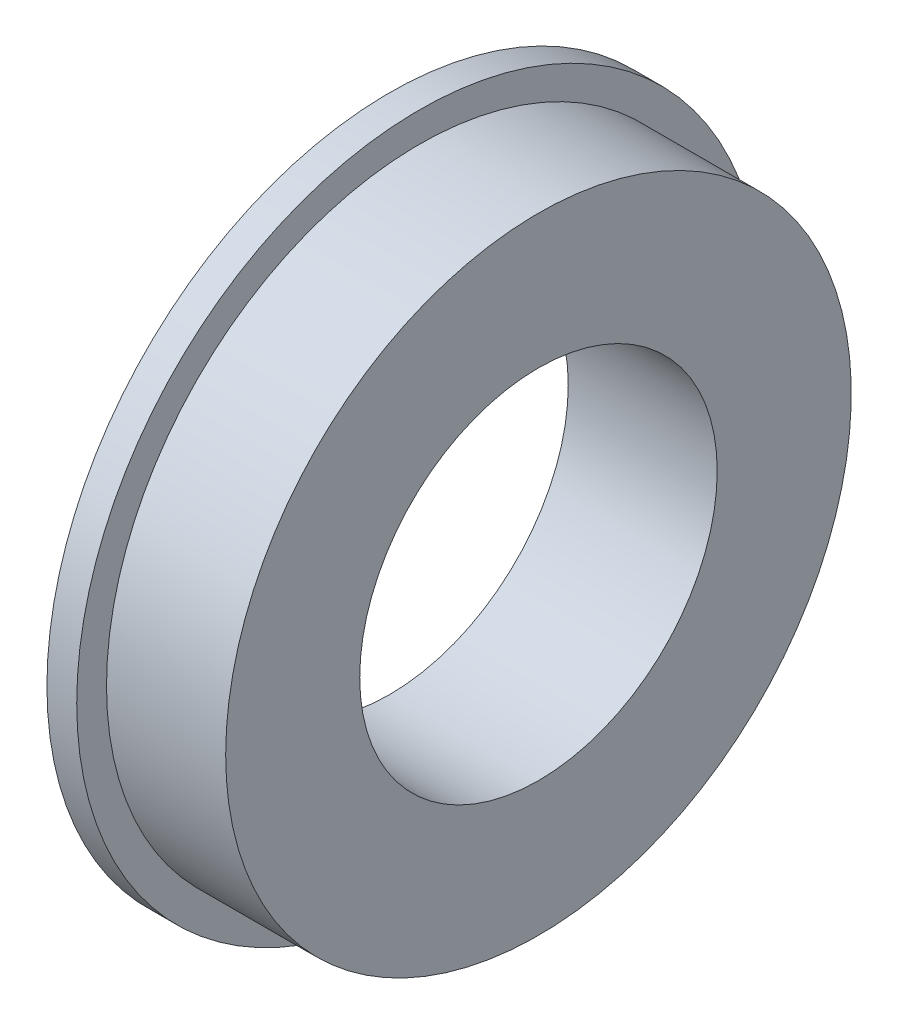
ISO-10303-21;
HEADER;
FILE_DESCRIPTION(('STEP AP214'),'2;1');
FILE_NAME('part.step','',(''),(''),'','','');
FILE_SCHEMA(('AUTOMOTIVE_DESIGN { 1 0 10303 214 1 1 1 1 }'));
ENDSEC;
DATA;
#1=APPLICATION_CONTEXT('core data for automotive mechanical design processes');
#2=APPLICATION_PROTOCOL_DEFINITION('international standard','automotive_design',2000,#1);
#3=PRODUCT_CONTEXT('',#1,'mechanical');
#4=PRODUCT('Part','Part','',(#3));
#5=PRODUCT_RELATED_PRODUCT_CATEGORY('part','',(#4));
#6=PRODUCT_DEFINITION_FORMATION('','',#4);
#7=PRODUCT_DEFINITION_CONTEXT('part definition',#1,'design');
#8=PRODUCT_DEFINITION('design','',#6,#7);
#9=PRODUCT_DEFINITION_SHAPE('','',#8);
#10=(LENGTH_UNIT() NAMED_UNIT(*) SI_UNIT(.MILLI.,.METRE.));
#11=(NAMED_UNIT(*) PLANE_ANGLE_UNIT() SI_UNIT($,.RADIAN.));
#12=(NAMED_UNIT(*) SI_UNIT($,.STERADIAN.) SOLID_ANGLE_UNIT());
#13=UNCERTAINTY_MEASURE_WITH_UNIT(LENGTH_MEASURE(1.E-05),#10,'distance_accuracy_value','');
#14=(GEOMETRIC_REPRESENTATION_CONTEXT(3) GLOBAL_UNCERTAINTY_ASSIGNED_CONTEXT((#13)) GLOBAL_UNIT_ASSIGNED_CONTEXT((#10,
#11,#12)) REPRESENTATION_CONTEXT('',''));
#15=CARTESIAN_POINT('',(0.,0.,0.));
#16=DIRECTION('',(0.,0.,1.));
#17=DIRECTION('',(1.,0.,0.));
#18=AXIS2_PLACEMENT_3D('',#15,#16,#17);
#19=CARTESIAN_POINT('',(0.,10.5,0.));
#20=DIRECTION('',(-1.,0.,0.));
#21=DIRECTION('',(0.,0.,1.));
#22=AXIS2_PLACEMENT_3D('',#19,#20,#21);
#23=PLANE('',#22);
#24=CARTESIAN_POINT('',(0.,0.,0.));
#25=DIRECTION('',(-1.,0.,0.));
#26=DIRECTION('',(0.,0.,1.));
#27=AXIS2_PLACEMENT_3D('',#24,#25,#26);
#28=CIRCLE('',#27,10.5);
#29=CARTESIAN_POINT('',(0.,0.,10.5));
#30=VERTEX_POINT('',#29);
#31=EDGE_CURVE('E54',#30,#30,#28,.T.);
#32=ORIENTED_EDGE('',*,*,#31,.F.);
#33=EDGE_LOOP('',(#32));
#34=FACE_BOUND('',#33,.T.);
#35=CARTESIAN_POINT('',(0.,0.,0.));
#36=DIRECTION('',(-1.,0.,0.));
#37=DIRECTION('',(0.,0.,1.));
#38=AXIS2_PLACEMENT_3D('',#35,#36,#37);
#39=CIRCLE('',#38,6.);
#40=CARTESIAN_POINT('',(0.,0.,6.));
#41=VERTEX_POINT('',#40);
#42=EDGE_CURVE('E10',#41,#41,#39,.T.);
#43=ORIENTED_EDGE('',*,*,#42,.T.);
#44=EDGE_LOOP('',(#43));
#45=FACE_BOUND('',#44,.T.);
#46=ADVANCED_FACE('F32',(#34,#45),#23,.F.);
#47=CARTESIAN_POINT('',(-18.4954128440367,0.,0.));
#48=DIRECTION('',(-1.,0.,0.));
#49=DIRECTION('',(0.,0.,1.));
#50=AXIS2_PLACEMENT_3D('',#47,#48,#49);
#51=CYLINDRICAL_SURFACE('',#50,6.);
#52=ORIENTED_EDGE('',*,*,#42,.F.);
#53=EDGE_LOOP('',(#52));
#54=FACE_BOUND('',#53,.T.);
#55=CARTESIAN_POINT('',(-5.,0.,0.));
#56=DIRECTION('',(-1.,0.,0.));
#57=DIRECTION('',(0.,0.,1.));
#58=AXIS2_PLACEMENT_3D('',#55,#56,#57);
#59=CIRCLE('',#58,6.);
#60=CARTESIAN_POINT('',(-5.,0.,6.));
#61=VERTEX_POINT('',#60);
#62=EDGE_CURVE('E38',#61,#61,#59,.T.);
#63=ORIENTED_EDGE('',*,*,#62,.T.);
#64=EDGE_LOOP('',(#63));
#65=FACE_BOUND('',#64,.T.);
#66=ADVANCED_FACE('F61',(#54,#65),#51,.F.);
#67=CARTESIAN_POINT('',(-5.,6.,0.));
#68=DIRECTION('',(1.,0.,0.));
#69=DIRECTION('',(0.,0.,-1.));
#70=AXIS2_PLACEMENT_3D('',#67,#68,#69);
#71=PLANE('',#70);
#72=ORIENTED_EDGE('',*,*,#62,.F.);
#73=EDGE_LOOP('',(#72));
#74=FACE_BOUND('',#73,.T.);
#75=CARTESIAN_POINT('',(-5.,0.,0.));
#76=DIRECTION('',(-1.,0.,0.));
#77=DIRECTION('',(0.,0.,1.));
#78=AXIS2_PLACEMENT_3D('',#75,#76,#77);
#79=CIRCLE('',#78,11.5);
#80=CARTESIAN_POINT('',(-5.,0.,11.5));
#81=VERTEX_POINT('',#80);
#82=EDGE_CURVE('E42',#81,#81,#79,.T.);
#83=ORIENTED_EDGE('',*,*,#82,.T.);
#84=EDGE_LOOP('',(#83));
#85=FACE_BOUND('',#84,.T.);
#86=ADVANCED_FACE('F65',(#74,#85),#71,.F.);
#87=CARTESIAN_POINT('',(-18.4954128440367,0.,0.));
#88=DIRECTION('',(-1.,0.,0.));
#89=DIRECTION('',(0.,0.,1.));
#90=AXIS2_PLACEMENT_3D('',#87,#88,#89);
#91=CYLINDRICAL_SURFACE('',#90,11.5);
#92=ORIENTED_EDGE('',*,*,#82,.F.);
#93=EDGE_LOOP('',(#92));
#94=FACE_BOUND('',#93,.T.);
#95=CARTESIAN_POINT('',(-4.,0.,0.));
#96=DIRECTION('',(-1.,0.,0.));
#97=DIRECTION('',(0.,0.,1.));
#98=AXIS2_PLACEMENT_3D('',#95,#96,#97);
#99=CIRCLE('',#98,11.5);
#100=CARTESIAN_POINT('',(-4.,0.,11.5));
#101=VERTEX_POINT('',#100);
#102=EDGE_CURVE('E46',#101,#101,#99,.T.);
#103=ORIENTED_EDGE('',*,*,#102,.T.);
#104=EDGE_LOOP('',(#103));
#105=FACE_BOUND('',#104,.T.);
#106=ADVANCED_FACE('F70',(#94,#105),#91,.T.);
#107=CARTESIAN_POINT('',(-4.,11.5,0.));
#108=DIRECTION('',(-1.,0.,0.));
#109=DIRECTION('',(0.,0.,1.));
#110=AXIS2_PLACEMENT_3D('',#107,#108,#109);
#111=PLANE('',#110);
#112=ORIENTED_EDGE('',*,*,#102,.F.);
#113=EDGE_LOOP('',(#112));
#114=FACE_BOUND('',#113,.T.);
#115=CARTESIAN_POINT('',(-4.,0.,0.));
#116=DIRECTION('',(-1.,0.,0.));
#117=DIRECTION('',(0.,0.,1.));
#118=AXIS2_PLACEMENT_3D('',#115,#116,#117);
#119=CIRCLE('',#118,10.5);
#120=CARTESIAN_POINT('',(-4.,0.,10.5));
#121=VERTEX_POINT('',#120);
#122=EDGE_CURVE('E51',#121,#121,#119,.T.);
#123=ORIENTED_EDGE('',*,*,#122,.T.);
#124=EDGE_LOOP('',(#123));
#125=FACE_BOUND('',#124,.T.);
#126=ADVANCED_FACE('F76',(#114,#125),#111,.F.);
#127=CARTESIAN_POINT('',(-18.4954128440367,0.,0.));
#128=DIRECTION('',(-1.,0.,0.));
#129=DIRECTION('',(0.,0.,1.));
#130=AXIS2_PLACEMENT_3D('',#127,#128,#129);
#131=CYLINDRICAL_SURFACE('',#130,10.5);
#132=ORIENTED_EDGE('',*,*,#122,.F.);
#133=EDGE_LOOP('',(#132));
#134=FACE_BOUND('',#133,.T.);
#135=ORIENTED_EDGE('',*,*,#31,.T.);
#136=EDGE_LOOP('',(#135));
#137=FACE_BOUND('',#136,.T.);
#138=ADVANCED_FACE('F58',(#134,#137),#131,.T.);
#139=CLOSED_SHELL('',(#46,#66,#86,#106,#126,#138));
#140=MANIFOLD_SOLID_BREP('B2',#139);
#141=ADVANCED_BREP_SHAPE_REPRESENTATION('',(#18,#140),#14);
#142=SHAPE_DEFINITION_REPRESENTATION(#9,#141);
ENDSEC;
END-ISO-10303-21;
